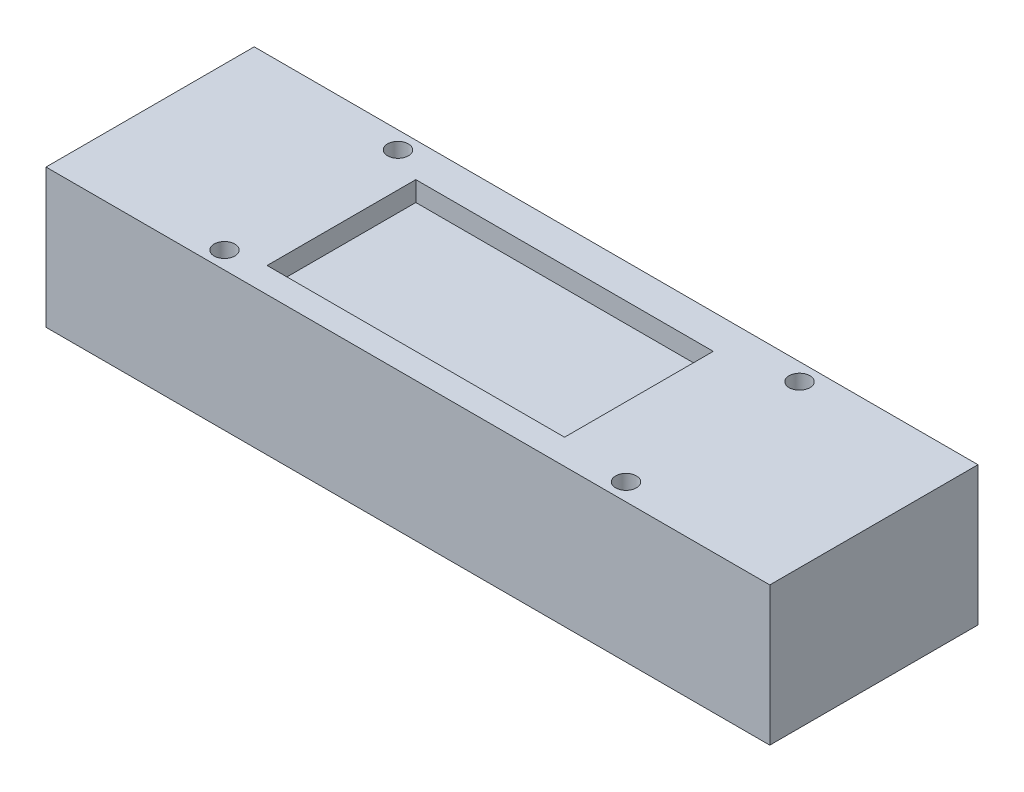
ISO-10303-21;
HEADER;
FILE_DESCRIPTION(('STEP AP214'),'2;1');
FILE_NAME('part.step','',(''),(''),'','','');
FILE_SCHEMA(('AUTOMOTIVE_DESIGN { 1 0 10303 214 1 1 1 1 }'));
ENDSEC;
DATA;
#1=APPLICATION_CONTEXT('core data for automotive mechanical design processes');
#2=APPLICATION_PROTOCOL_DEFINITION('international standard','automotive_design',2000,#1);
#3=PRODUCT_CONTEXT('',#1,'mechanical');
#4=PRODUCT('Part','Part','',(#3));
#5=PRODUCT_RELATED_PRODUCT_CATEGORY('part','',(#4));
#6=PRODUCT_DEFINITION_FORMATION('','',#4);
#7=PRODUCT_DEFINITION_CONTEXT('part definition',#1,'design');
#8=PRODUCT_DEFINITION('design','',#6,#7);
#9=PRODUCT_DEFINITION_SHAPE('','',#8);
#10=(LENGTH_UNIT() NAMED_UNIT(*) SI_UNIT(.MILLI.,.METRE.));
#11=(NAMED_UNIT(*) PLANE_ANGLE_UNIT() SI_UNIT($,.RADIAN.));
#12=(NAMED_UNIT(*) SI_UNIT($,.STERADIAN.) SOLID_ANGLE_UNIT());
#13=UNCERTAINTY_MEASURE_WITH_UNIT(LENGTH_MEASURE(1.E-05),#10,'distance_accuracy_value','');
#14=(GEOMETRIC_REPRESENTATION_CONTEXT(3) GLOBAL_UNCERTAINTY_ASSIGNED_CONTEXT((#13)) GLOBAL_UNIT_ASSIGNED_CONTEXT((#10,
#11,#12)) REPRESENTATION_CONTEXT('',''));
#15=CARTESIAN_POINT('',(0.,0.,0.));
#16=DIRECTION('',(0.,0.,1.));
#17=DIRECTION('',(1.,0.,0.));
#18=AXIS2_PLACEMENT_3D('',#15,#16,#17);
#19=CARTESIAN_POINT('',(0.,14.,0.));
#20=DIRECTION('',(0.,1.,0.));
#21=DIRECTION('',(0.,0.,1.));
#22=AXIS2_PLACEMENT_3D('',#19,#20,#21);
#23=PLANE('',#22);
#24=DIRECTION('',(0.,0.,1.));
#25=VECTOR('',#24,1.);
#26=CARTESIAN_POINT('',(-16.75,14.,-7.05));
#27=LINE('',#26,#25);
#28=CARTESIAN_POINT('',(-16.75,14.,-7.05));
#29=VERTEX_POINT('',#28);
#30=CARTESIAN_POINT('',(-16.75,14.,7.94999999999999));
#31=VERTEX_POINT('',#30);
#32=EDGE_CURVE('E55',#29,#31,#27,.T.);
#33=ORIENTED_EDGE('',*,*,#32,.F.);
#34=DIRECTION('',(-1.,0.,0.));
#35=VECTOR('',#34,1.);
#36=CARTESIAN_POINT('',(-16.75,14.,-7.05));
#37=LINE('',#36,#35);
#38=CARTESIAN_POINT('',(13.25,14.,-7.05));
#39=VERTEX_POINT('',#38);
#40=EDGE_CURVE('E134',#39,#29,#37,.T.);
#41=ORIENTED_EDGE('',*,*,#40,.F.);
#42=DIRECTION('',(0.,0.,-1.));
#43=VECTOR('',#42,1.);
#44=CARTESIAN_POINT('',(13.25,14.,-7.05));
#45=LINE('',#44,#43);
#46=CARTESIAN_POINT('',(13.25,14.,7.94999999999999));
#47=VERTEX_POINT('',#46);
#48=EDGE_CURVE('E137',#47,#39,#45,.T.);
#49=ORIENTED_EDGE('',*,*,#48,.F.);
#50=DIRECTION('',(1.,0.,0.));
#51=VECTOR('',#50,1.);
#52=CARTESIAN_POINT('',(-16.75,14.,7.94999999999999));
#53=LINE('',#52,#51);
#54=EDGE_CURVE('E143',#31,#47,#53,.T.);
#55=ORIENTED_EDGE('',*,*,#54,.F.);
#56=EDGE_LOOP('',(#33,#41,#49,#55));
#57=FACE_BOUND('',#56,.T.);
#58=CARTESIAN_POINT('',(20.25,14.,8.75));
#59=DIRECTION('',(0.,1.,0.));
#60=DIRECTION('',(0.,0.,1.));
#61=AXIS2_PLACEMENT_3D('',#58,#59,#60);
#62=CIRCLE('',#61,1.05);
#63=CARTESIAN_POINT('',(20.25,14.,9.8));
#64=VERTEX_POINT('',#63);
#65=EDGE_CURVE('E159',#64,#64,#62,.T.);
#66=ORIENTED_EDGE('',*,*,#65,.F.);
#67=EDGE_LOOP('',(#66));
#68=FACE_BOUND('',#67,.T.);
#69=CARTESIAN_POINT('',(-20.25,14.,-8.75));
#70=DIRECTION('',(0.,1.,0.));
#71=DIRECTION('',(0.,0.,1.));
#72=AXIS2_PLACEMENT_3D('',#69,#70,#71);
#73=CIRCLE('',#72,1.05);
#74=CARTESIAN_POINT('',(-20.25,14.,-7.70000000000001));
#75=VERTEX_POINT('',#74);
#76=EDGE_CURVE('E171',#75,#75,#73,.T.);
#77=ORIENTED_EDGE('',*,*,#76,.F.);
#78=EDGE_LOOP('',(#77));
#79=FACE_BOUND('',#78,.T.);
#80=DIRECTION('',(0.,0.,-1.));
#81=VECTOR('',#80,1.);
#82=CARTESIAN_POINT('',(36.5,14.,-10.5));
#83=LINE('',#82,#81);
#84=CARTESIAN_POINT('',(36.5,14.,10.5));
#85=VERTEX_POINT('',#84);
#86=CARTESIAN_POINT('',(36.5,14.,-10.5));
#87=VERTEX_POINT('',#86);
#88=EDGE_CURVE('E177',#85,#87,#83,.T.);
#89=ORIENTED_EDGE('',*,*,#88,.T.);
#90=DIRECTION('',(-1.,0.,0.));
#91=VECTOR('',#90,1.);
#92=CARTESIAN_POINT('',(-36.5,14.,-10.5));
#93=LINE('',#92,#91);
#94=CARTESIAN_POINT('',(-36.5,14.,-10.5));
#95=VERTEX_POINT('',#94);
#96=EDGE_CURVE('E92',#87,#95,#93,.T.);
#97=ORIENTED_EDGE('',*,*,#96,.T.);
#98=DIRECTION('',(0.,0.,1.));
#99=VECTOR('',#98,1.);
#100=CARTESIAN_POINT('',(-36.5,14.,-10.5));
#101=LINE('',#100,#99);
#102=CARTESIAN_POINT('',(-36.5,14.,10.5));
#103=VERTEX_POINT('',#102);
#104=EDGE_CURVE('E180',#95,#103,#101,.T.);
#105=ORIENTED_EDGE('',*,*,#104,.T.);
#106=DIRECTION('',(1.,0.,0.));
#107=VECTOR('',#106,1.);
#108=CARTESIAN_POINT('',(-36.5,14.,10.5));
#109=LINE('',#108,#107);
#110=EDGE_CURVE('E64',#103,#85,#109,.T.);
#111=ORIENTED_EDGE('',*,*,#110,.T.);
#112=EDGE_LOOP('',(#89,#97,#105,#111));
#113=FACE_BOUND('',#112,.T.);
#114=CARTESIAN_POINT('',(20.25,14.,-8.75));
#115=DIRECTION('',(0.,1.,0.));
#116=DIRECTION('',(0.,0.,1.));
#117=AXIS2_PLACEMENT_3D('',#114,#115,#116);
#118=CIRCLE('',#117,1.05);
#119=CARTESIAN_POINT('',(20.25,14.,-7.70000000000001));
#120=VERTEX_POINT('',#119);
#121=EDGE_CURVE('E165',#120,#120,#118,.T.);
#122=ORIENTED_EDGE('',*,*,#121,.F.);
#123=EDGE_LOOP('',(#122));
#124=FACE_BOUND('',#123,.T.);
#125=CARTESIAN_POINT('',(-20.25,14.,8.75));
#126=DIRECTION('',(0.,1.,0.));
#127=DIRECTION('',(0.,0.,1.));
#128=AXIS2_PLACEMENT_3D('',#125,#126,#127);
#129=CIRCLE('',#128,1.05);
#130=CARTESIAN_POINT('',(-20.25,14.,9.8));
#131=VERTEX_POINT('',#130);
#132=EDGE_CURVE('E153',#131,#131,#129,.T.);
#133=ORIENTED_EDGE('',*,*,#132,.F.);
#134=EDGE_LOOP('',(#133));
#135=FACE_BOUND('',#134,.T.);
#136=ADVANCED_FACE('F40',(#57,#68,#79,#113,#124,#135),#23,.T.);
#137=CARTESIAN_POINT('',(0.,0.,0.));
#138=DIRECTION('',(0.,1.,0.));
#139=DIRECTION('',(0.,0.,1.));
#140=AXIS2_PLACEMENT_3D('',#137,#138,#139);
#141=PLANE('',#140);
#142=DIRECTION('',(0.,0.,-1.));
#143=VECTOR('',#142,1.);
#144=CARTESIAN_POINT('',(36.5,0.,-10.5));
#145=LINE('',#144,#143);
#146=CARTESIAN_POINT('',(36.5,0.,10.5));
#147=VERTEX_POINT('',#146);
#148=CARTESIAN_POINT('',(36.5,0.,-10.5));
#149=VERTEX_POINT('',#148);
#150=EDGE_CURVE('E174',#147,#149,#145,.T.);
#151=ORIENTED_EDGE('',*,*,#150,.F.);
#152=DIRECTION('',(1.,0.,0.));
#153=VECTOR('',#152,1.);
#154=CARTESIAN_POINT('',(-36.5,0.,10.5));
#155=LINE('',#154,#153);
#156=CARTESIAN_POINT('',(-36.5,0.,10.5));
#157=VERTEX_POINT('',#156);
#158=EDGE_CURVE('E85',#157,#147,#155,.T.);
#159=ORIENTED_EDGE('',*,*,#158,.F.);
#160=DIRECTION('',(0.,0.,1.));
#161=VECTOR('',#160,1.);
#162=CARTESIAN_POINT('',(-36.5,0.,-10.5));
#163=LINE('',#162,#161);
#164=CARTESIAN_POINT('',(-36.5,0.,-10.5));
#165=VERTEX_POINT('',#164);
#166=EDGE_CURVE('E188',#165,#157,#163,.T.);
#167=ORIENTED_EDGE('',*,*,#166,.F.);
#168=DIRECTION('',(-1.,0.,0.));
#169=VECTOR('',#168,1.);
#170=CARTESIAN_POINT('',(-36.5,0.,-10.5));
#171=LINE('',#170,#169);
#172=EDGE_CURVE('E186',#149,#165,#171,.T.);
#173=ORIENTED_EDGE('',*,*,#172,.F.);
#174=EDGE_LOOP('',(#151,#159,#167,#173));
#175=FACE_BOUND('',#174,.T.);
#176=CARTESIAN_POINT('',(-20.25,0.,-8.75));
#177=DIRECTION('',(0.,1.,0.));
#178=DIRECTION('',(0.,0.,1.));
#179=AXIS2_PLACEMENT_3D('',#176,#177,#178);
#180=CIRCLE('',#179,1.05);
#181=CARTESIAN_POINT('',(-20.25,0.,-7.70000000000001));
#182=VERTEX_POINT('',#181);
#183=EDGE_CURVE('E168',#182,#182,#180,.T.);
#184=ORIENTED_EDGE('',*,*,#183,.T.);
#185=EDGE_LOOP('',(#184));
#186=FACE_BOUND('',#185,.T.);
#187=CARTESIAN_POINT('',(20.25,0.,-8.75));
#188=DIRECTION('',(0.,1.,0.));
#189=DIRECTION('',(0.,0.,1.));
#190=AXIS2_PLACEMENT_3D('',#187,#188,#189);
#191=CIRCLE('',#190,1.05);
#192=CARTESIAN_POINT('',(20.25,0.,-7.70000000000001));
#193=VERTEX_POINT('',#192);
#194=EDGE_CURVE('E162',#193,#193,#191,.T.);
#195=ORIENTED_EDGE('',*,*,#194,.T.);
#196=EDGE_LOOP('',(#195));
#197=FACE_BOUND('',#196,.T.);
#198=CARTESIAN_POINT('',(20.25,0.,8.75));
#199=DIRECTION('',(0.,1.,0.));
#200=DIRECTION('',(0.,0.,1.));
#201=AXIS2_PLACEMENT_3D('',#198,#199,#200);
#202=CIRCLE('',#201,1.05);
#203=CARTESIAN_POINT('',(20.25,0.,9.8));
#204=VERTEX_POINT('',#203);
#205=EDGE_CURVE('E156',#204,#204,#202,.T.);
#206=ORIENTED_EDGE('',*,*,#205,.T.);
#207=EDGE_LOOP('',(#206));
#208=FACE_BOUND('',#207,.T.);
#209=CARTESIAN_POINT('',(-20.25,0.,8.75));
#210=DIRECTION('',(0.,1.,0.));
#211=DIRECTION('',(0.,0.,1.));
#212=AXIS2_PLACEMENT_3D('',#209,#210,#211);
#213=CIRCLE('',#212,1.05);
#214=CARTESIAN_POINT('',(-20.25,0.,9.8));
#215=VERTEX_POINT('',#214);
#216=EDGE_CURVE('E149',#215,#215,#213,.T.);
#217=ORIENTED_EDGE('',*,*,#216,.T.);
#218=EDGE_LOOP('',(#217));
#219=FACE_BOUND('',#218,.T.);
#220=ADVANCED_FACE('F201',(#175,#186,#197,#208,#219),#141,.F.);
#221=CARTESIAN_POINT('',(36.5,14.,-10.5));
#222=DIRECTION('',(-1.,0.,0.));
#223=DIRECTION('',(0.,0.,1.));
#224=AXIS2_PLACEMENT_3D('',#221,#222,#223);
#225=PLANE('',#224);
#226=ORIENTED_EDGE('',*,*,#150,.T.);
#227=DIRECTION('',(0.,-1.,0.));
#228=VECTOR('',#227,1.);
#229=CARTESIAN_POINT('',(36.5,14.,-10.5));
#230=LINE('',#229,#228);
#231=EDGE_CURVE('E11',#87,#149,#230,.T.);
#232=ORIENTED_EDGE('',*,*,#231,.F.);
#233=ORIENTED_EDGE('',*,*,#88,.F.);
#234=DIRECTION('',(0.,-1.,0.));
#235=VECTOR('',#234,1.);
#236=CARTESIAN_POINT('',(36.5,14.,10.5));
#237=LINE('',#236,#235);
#238=EDGE_CURVE('E183',#85,#147,#237,.T.);
#239=ORIENTED_EDGE('',*,*,#238,.T.);
#240=EDGE_LOOP('',(#226,#232,#233,#239));
#241=FACE_BOUND('',#240,.T.);
#242=ADVANCED_FACE('F42',(#241),#225,.F.);
#243=CARTESIAN_POINT('',(-36.5,14.,-10.5));
#244=DIRECTION('',(0.,0.,1.));
#245=DIRECTION('',(1.,0.,0.));
#246=AXIS2_PLACEMENT_3D('',#243,#244,#245);
#247=PLANE('',#246);
#248=ORIENTED_EDGE('',*,*,#172,.T.);
#249=DIRECTION('',(0.,-1.,0.));
#250=VECTOR('',#249,1.);
#251=CARTESIAN_POINT('',(-36.5,14.,-10.5));
#252=LINE('',#251,#250);
#253=EDGE_CURVE('E48',#95,#165,#252,.T.);
#254=ORIENTED_EDGE('',*,*,#253,.F.);
#255=ORIENTED_EDGE('',*,*,#96,.F.);
#256=ORIENTED_EDGE('',*,*,#231,.T.);
#257=EDGE_LOOP('',(#248,#254,#255,#256));
#258=FACE_BOUND('',#257,.T.);
#259=ADVANCED_FACE('F217',(#258),#247,.F.);
#260=CARTESIAN_POINT('',(-36.5,14.,-10.5));
#261=DIRECTION('',(1.,0.,0.));
#262=DIRECTION('',(0.,0.,-1.));
#263=AXIS2_PLACEMENT_3D('',#260,#261,#262);
#264=PLANE('',#263);
#265=ORIENTED_EDGE('',*,*,#166,.T.);
#266=DIRECTION('',(0.,-1.,0.));
#267=VECTOR('',#266,1.);
#268=CARTESIAN_POINT('',(-36.5,14.,10.5));
#269=LINE('',#268,#267);
#270=EDGE_CURVE('E192',#103,#157,#269,.T.);
#271=ORIENTED_EDGE('',*,*,#270,.F.);
#272=ORIENTED_EDGE('',*,*,#104,.F.);
#273=ORIENTED_EDGE('',*,*,#253,.T.);
#274=EDGE_LOOP('',(#265,#271,#272,#273));
#275=FACE_BOUND('',#274,.T.);
#276=ADVANCED_FACE('F197',(#275),#264,.F.);
#277=CARTESIAN_POINT('',(-36.5,14.,10.5));
#278=DIRECTION('',(0.,0.,-1.));
#279=DIRECTION('',(-1.,0.,0.));
#280=AXIS2_PLACEMENT_3D('',#277,#278,#279);
#281=PLANE('',#280);
#282=ORIENTED_EDGE('',*,*,#158,.T.);
#283=ORIENTED_EDGE('',*,*,#238,.F.);
#284=ORIENTED_EDGE('',*,*,#110,.F.);
#285=ORIENTED_EDGE('',*,*,#270,.T.);
#286=EDGE_LOOP('',(#282,#283,#284,#285));
#287=FACE_BOUND('',#286,.T.);
#288=ADVANCED_FACE('F206',(#287),#281,.F.);
#289=CARTESIAN_POINT('',(-20.25,14.,-8.75));
#290=DIRECTION('',(0.,-1.,0.));
#291=DIRECTION('',(0.,0.,-1.));
#292=AXIS2_PLACEMENT_3D('',#289,#290,#291);
#293=CYLINDRICAL_SURFACE('',#292,1.05);
#294=ORIENTED_EDGE('',*,*,#76,.T.);
#295=EDGE_LOOP('',(#294));
#296=FACE_BOUND('',#295,.T.);
#297=ORIENTED_EDGE('',*,*,#183,.F.);
#298=EDGE_LOOP('',(#297));
#299=FACE_BOUND('',#298,.T.);
#300=ADVANCED_FACE('F208',(#296,#299),#293,.F.);
#301=CARTESIAN_POINT('',(20.25,14.,-8.75));
#302=DIRECTION('',(0.,-1.,0.));
#303=DIRECTION('',(0.,0.,-1.));
#304=AXIS2_PLACEMENT_3D('',#301,#302,#303);
#305=CYLINDRICAL_SURFACE('',#304,1.05);
#306=ORIENTED_EDGE('',*,*,#121,.T.);
#307=EDGE_LOOP('',(#306));
#308=FACE_BOUND('',#307,.T.);
#309=ORIENTED_EDGE('',*,*,#194,.F.);
#310=EDGE_LOOP('',(#309));
#311=FACE_BOUND('',#310,.T.);
#312=ADVANCED_FACE('F214',(#308,#311),#305,.F.);
#313=CARTESIAN_POINT('',(20.25,14.,8.75));
#314=DIRECTION('',(0.,-1.,0.));
#315=DIRECTION('',(0.,0.,-1.));
#316=AXIS2_PLACEMENT_3D('',#313,#314,#315);
#317=CYLINDRICAL_SURFACE('',#316,1.05);
#318=ORIENTED_EDGE('',*,*,#65,.T.);
#319=EDGE_LOOP('',(#318));
#320=FACE_BOUND('',#319,.T.);
#321=ORIENTED_EDGE('',*,*,#205,.F.);
#322=EDGE_LOOP('',(#321));
#323=FACE_BOUND('',#322,.T.);
#324=ADVANCED_FACE('F230',(#320,#323),#317,.F.);
#325=CARTESIAN_POINT('',(-20.25,14.,8.75));
#326=DIRECTION('',(0.,-1.,0.));
#327=DIRECTION('',(0.,0.,-1.));
#328=AXIS2_PLACEMENT_3D('',#325,#326,#327);
#329=CYLINDRICAL_SURFACE('',#328,1.05);
#330=ORIENTED_EDGE('',*,*,#132,.T.);
#331=EDGE_LOOP('',(#330));
#332=FACE_BOUND('',#331,.T.);
#333=ORIENTED_EDGE('',*,*,#216,.F.);
#334=EDGE_LOOP('',(#333));
#335=FACE_BOUND('',#334,.T.);
#336=ADVANCED_FACE('F234',(#332,#335),#329,.F.);
#337=CARTESIAN_POINT('',(-16.75,12.,-7.05));
#338=DIRECTION('',(-1.,0.,0.));
#339=DIRECTION('',(0.,0.,1.));
#340=AXIS2_PLACEMENT_3D('',#337,#338,#339);
#341=PLANE('',#340);
#342=ORIENTED_EDGE('',*,*,#32,.T.);
#343=DIRECTION('',(0.,1.,0.));
#344=VECTOR('',#343,1.);
#345=CARTESIAN_POINT('',(-16.75,12.,7.94999999999999));
#346=LINE('',#345,#344);
#347=CARTESIAN_POINT('',(-16.75,12.,7.94999999999999));
#348=VERTEX_POINT('',#347);
#349=EDGE_CURVE('E112',#348,#31,#346,.T.);
#350=ORIENTED_EDGE('',*,*,#349,.F.);
#351=DIRECTION('',(0.,0.,1.));
#352=VECTOR('',#351,1.);
#353=CARTESIAN_POINT('',(-16.75,12.,-7.05));
#354=LINE('',#353,#352);
#355=CARTESIAN_POINT('',(-16.75,12.,-7.05));
#356=VERTEX_POINT('',#355);
#357=EDGE_CURVE('E116',#356,#348,#354,.T.);
#358=ORIENTED_EDGE('',*,*,#357,.F.);
#359=DIRECTION('',(0.,1.,0.));
#360=VECTOR('',#359,1.);
#361=CARTESIAN_POINT('',(-16.75,12.,-7.05));
#362=LINE('',#361,#360);
#363=EDGE_CURVE('E147',#356,#29,#362,.T.);
#364=ORIENTED_EDGE('',*,*,#363,.T.);
#365=EDGE_LOOP('',(#342,#350,#358,#364));
#366=FACE_BOUND('',#365,.T.);
#367=ADVANCED_FACE('F114',(#366),#341,.F.);
#368=CARTESIAN_POINT('',(-16.75,12.,-7.05));
#369=DIRECTION('',(0.,0.,-1.));
#370=DIRECTION('',(-1.,0.,0.));
#371=AXIS2_PLACEMENT_3D('',#368,#369,#370);
#372=PLANE('',#371);
#373=ORIENTED_EDGE('',*,*,#40,.T.);
#374=ORIENTED_EDGE('',*,*,#363,.F.);
#375=DIRECTION('',(-1.,0.,0.));
#376=VECTOR('',#375,1.);
#377=CARTESIAN_POINT('',(-16.75,12.,-7.05));
#378=LINE('',#377,#376);
#379=CARTESIAN_POINT('',(13.25,12.,-7.05));
#380=VERTEX_POINT('',#379);
#381=EDGE_CURVE('E122',#380,#356,#378,.T.);
#382=ORIENTED_EDGE('',*,*,#381,.F.);
#383=DIRECTION('',(0.,1.,0.));
#384=VECTOR('',#383,1.);
#385=CARTESIAN_POINT('',(13.25,12.,-7.05));
#386=LINE('',#385,#384);
#387=EDGE_CURVE('E150',#380,#39,#386,.T.);
#388=ORIENTED_EDGE('',*,*,#387,.T.);
#389=EDGE_LOOP('',(#373,#374,#382,#388));
#390=FACE_BOUND('',#389,.T.);
#391=ADVANCED_FACE('F241',(#390),#372,.F.);
#392=CARTESIAN_POINT('',(13.25,12.,-7.05));
#393=DIRECTION('',(1.,0.,0.));
#394=DIRECTION('',(0.,0.,-1.));
#395=AXIS2_PLACEMENT_3D('',#392,#393,#394);
#396=PLANE('',#395);
#397=ORIENTED_EDGE('',*,*,#48,.T.);
#398=ORIENTED_EDGE('',*,*,#387,.F.);
#399=DIRECTION('',(0.,0.,-1.));
#400=VECTOR('',#399,1.);
#401=CARTESIAN_POINT('',(13.25,12.,-7.05));
#402=LINE('',#401,#400);
#403=CARTESIAN_POINT('',(13.25,12.,7.94999999999999));
#404=VERTEX_POINT('',#403);
#405=EDGE_CURVE('E130',#404,#380,#402,.T.);
#406=ORIENTED_EDGE('',*,*,#405,.F.);
#407=DIRECTION('',(0.,1.,0.));
#408=VECTOR('',#407,1.);
#409=CARTESIAN_POINT('',(13.25,12.,7.94999999999999));
#410=LINE('',#409,#408);
#411=EDGE_CURVE('E121',#404,#47,#410,.T.);
#412=ORIENTED_EDGE('',*,*,#411,.T.);
#413=EDGE_LOOP('',(#397,#398,#406,#412));
#414=FACE_BOUND('',#413,.T.);
#415=ADVANCED_FACE('F244',(#414),#396,.F.);
#416=CARTESIAN_POINT('',(-16.75,12.,7.94999999999999));
#417=DIRECTION('',(0.,0.,1.));
#418=DIRECTION('',(1.,0.,0.));
#419=AXIS2_PLACEMENT_3D('',#416,#417,#418);
#420=PLANE('',#419);
#421=ORIENTED_EDGE('',*,*,#54,.T.);
#422=ORIENTED_EDGE('',*,*,#411,.F.);
#423=DIRECTION('',(1.,0.,0.));
#424=VECTOR('',#423,1.);
#425=CARTESIAN_POINT('',(-16.75,12.,7.94999999999999));
#426=LINE('',#425,#424);
#427=EDGE_CURVE('E125',#348,#404,#426,.T.);
#428=ORIENTED_EDGE('',*,*,#427,.F.);
#429=ORIENTED_EDGE('',*,*,#349,.T.);
#430=EDGE_LOOP('',(#421,#422,#428,#429));
#431=FACE_BOUND('',#430,.T.);
#432=ADVANCED_FACE('F126',(#431),#420,.F.);
#433=CARTESIAN_POINT('',(0.,12.,0.));
#434=DIRECTION('',(0.,1.,0.));
#435=DIRECTION('',(0.,0.,1.));
#436=AXIS2_PLACEMENT_3D('',#433,#434,#435);
#437=PLANE('',#436);
#438=ORIENTED_EDGE('',*,*,#357,.T.);
#439=ORIENTED_EDGE('',*,*,#427,.T.);
#440=ORIENTED_EDGE('',*,*,#405,.T.);
#441=ORIENTED_EDGE('',*,*,#381,.T.);
#442=EDGE_LOOP('',(#438,#439,#440,#441));
#443=FACE_BOUND('',#442,.T.);
#444=ADVANCED_FACE('F132',(#443),#437,.T.);
#445=CLOSED_SHELL('',(#136,#220,#242,#259,#276,#288,#300,#312,#324,#336,#367,#391,#415,#432,#444));
#446=MANIFOLD_SOLID_BREP('B2',#445);
#447=ADVANCED_BREP_SHAPE_REPRESENTATION('',(#18,#446),#14);
#448=SHAPE_DEFINITION_REPRESENTATION(#9,#447);
ENDSEC;
END-ISO-10303-21;
